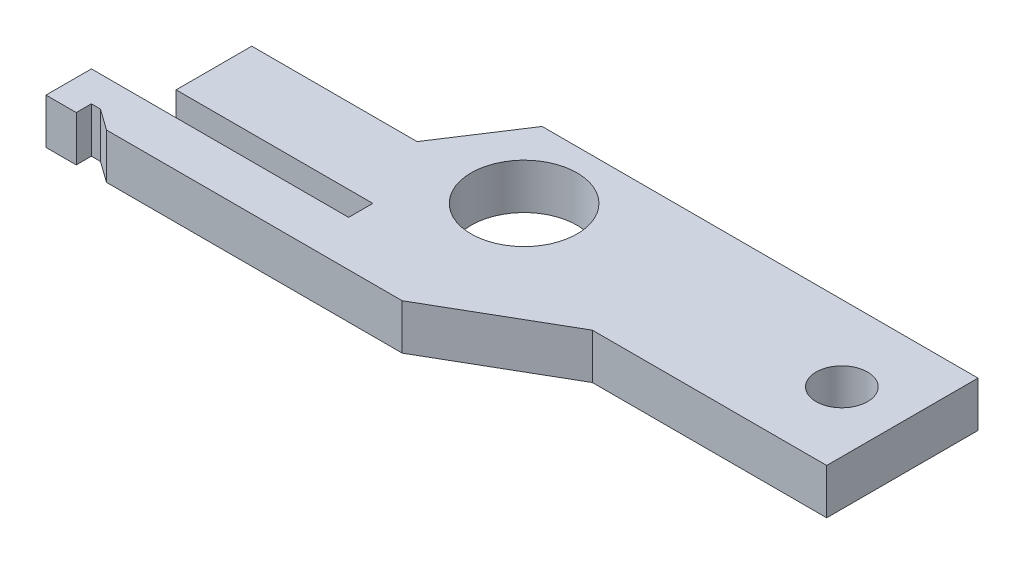
ISO-10303-21;
HEADER;
FILE_DESCRIPTION(('STEP AP214'),'2;1');
FILE_NAME('part.step','',(''),(''),'','','');
FILE_SCHEMA(('AUTOMOTIVE_DESIGN { 1 0 10303 214 1 1 1 1 }'));
ENDSEC;
DATA;
#1=APPLICATION_CONTEXT('core data for automotive mechanical design processes');
#2=APPLICATION_PROTOCOL_DEFINITION('international standard','automotive_design',2000,#1);
#3=PRODUCT_CONTEXT('',#1,'mechanical');
#4=PRODUCT('Part','Part','',(#3));
#5=PRODUCT_RELATED_PRODUCT_CATEGORY('part','',(#4));
#6=PRODUCT_DEFINITION_FORMATION('','',#4);
#7=PRODUCT_DEFINITION_CONTEXT('part definition',#1,'design');
#8=PRODUCT_DEFINITION('design','',#6,#7);
#9=PRODUCT_DEFINITION_SHAPE('','',#8);
#10=(LENGTH_UNIT() NAMED_UNIT(*) SI_UNIT(.MILLI.,.METRE.));
#11=(NAMED_UNIT(*) PLANE_ANGLE_UNIT() SI_UNIT($,.RADIAN.));
#12=(NAMED_UNIT(*) SI_UNIT($,.STERADIAN.) SOLID_ANGLE_UNIT());
#13=UNCERTAINTY_MEASURE_WITH_UNIT(LENGTH_MEASURE(1.E-05),#10,'distance_accuracy_value','');
#14=(GEOMETRIC_REPRESENTATION_CONTEXT(3) GLOBAL_UNCERTAINTY_ASSIGNED_CONTEXT((#13)) GLOBAL_UNIT_ASSIGNED_CONTEXT((#10,
#11,#12)) REPRESENTATION_CONTEXT('',''));
#15=CARTESIAN_POINT('',(0.,0.,0.));
#16=DIRECTION('',(0.,0.,1.));
#17=DIRECTION('',(1.,0.,0.));
#18=AXIS2_PLACEMENT_3D('',#15,#16,#17);
#19=CARTESIAN_POINT('',(-1.9,5.59679211209294,0.));
#20=DIRECTION('',(-1.,0.,0.));
#21=DIRECTION('',(0.,-1.,0.));
#22=AXIS2_PLACEMENT_3D('',#19,#20,#21);
#23=PLANE('',#22);
#24=DIRECTION('',(0.,0.,1.));
#25=VECTOR('',#24,1.);
#26=CARTESIAN_POINT('',(-1.9,7.09679211209294,0.));
#27=LINE('',#26,#25);
#28=CARTESIAN_POINT('',(-1.9,7.09679211209294,-0.8));
#29=VERTEX_POINT('',#28);
#30=CARTESIAN_POINT('',(-1.9,7.09679211209294,0.));
#31=VERTEX_POINT('',#30);
#32=EDGE_CURVE('E179',#29,#31,#27,.T.);
#33=ORIENTED_EDGE('',*,*,#32,.F.);
#34=DIRECTION('',(0.,1.,0.));
#35=VECTOR('',#34,1.);
#36=CARTESIAN_POINT('',(-1.9,5.59679211209294,-0.8));
#37=LINE('',#36,#35);
#38=CARTESIAN_POINT('',(-1.9,5.59679211209294,-0.8));
#39=VERTEX_POINT('',#38);
#40=EDGE_CURVE('E11',#39,#29,#37,.T.);
#41=ORIENTED_EDGE('',*,*,#40,.F.);
#42=DIRECTION('',(0.,0.,1.));
#43=VECTOR('',#42,1.);
#44=CARTESIAN_POINT('',(-1.9,5.59679211209294,0.));
#45=LINE('',#44,#43);
#46=CARTESIAN_POINT('',(-1.9,5.59679211209294,0.));
#47=VERTEX_POINT('',#46);
#48=EDGE_CURVE('E224',#39,#47,#45,.T.);
#49=ORIENTED_EDGE('',*,*,#48,.T.);
#50=DIRECTION('',(0.,1.,0.));
#51=VECTOR('',#50,1.);
#52=CARTESIAN_POINT('',(-1.9,5.59679211209294,0.));
#53=LINE('',#52,#51);
#54=EDGE_CURVE('E37',#47,#31,#53,.T.);
#55=ORIENTED_EDGE('',*,*,#54,.T.);
#56=EDGE_LOOP('',(#33,#41,#49,#55));
#57=FACE_BOUND('',#56,.T.);
#58=ADVANCED_FACE('F34',(#57),#23,.T.);
#59=CARTESIAN_POINT('',(-1.9,5.59679211209294,-0.8));
#60=DIRECTION('',(0.,0.,1.));
#61=DIRECTION('',(1.,0.,0.));
#62=AXIS2_PLACEMENT_3D('',#59,#60,#61);
#63=PLANE('',#62);
#64=DIRECTION('',(1.,0.,0.));
#65=VECTOR('',#64,1.);
#66=CARTESIAN_POINT('',(-1.9,7.09679211209294,-0.8));
#67=LINE('',#66,#65);
#68=CARTESIAN_POINT('',(-8.4,7.09679211209294,-0.799999999999999));
#69=VERTEX_POINT('',#68);
#70=EDGE_CURVE('E222',#69,#29,#67,.T.);
#71=ORIENTED_EDGE('',*,*,#70,.F.);
#72=DIRECTION('',(0.,1.,0.));
#73=VECTOR('',#72,1.);
#74=CARTESIAN_POINT('',(-8.4,5.59679211209294,-0.799999999999999));
#75=LINE('',#74,#73);
#76=CARTESIAN_POINT('',(-8.4,5.59679211209294,-0.799999999999999));
#77=VERTEX_POINT('',#76);
#78=EDGE_CURVE('E43',#77,#69,#75,.T.);
#79=ORIENTED_EDGE('',*,*,#78,.F.);
#80=DIRECTION('',(1.,0.,0.));
#81=VECTOR('',#80,1.);
#82=CARTESIAN_POINT('',(-1.9,5.59679211209294,-0.8));
#83=LINE('',#82,#81);
#84=EDGE_CURVE('E169',#77,#39,#83,.T.);
#85=ORIENTED_EDGE('',*,*,#84,.T.);
#86=ORIENTED_EDGE('',*,*,#40,.T.);
#87=EDGE_LOOP('',(#71,#79,#85,#86));
#88=FACE_BOUND('',#87,.T.);
#89=ADVANCED_FACE('F252',(#88),#63,.T.);
#90=CARTESIAN_POINT('',(-8.4,5.59679211209294,-3.3));
#91=DIRECTION('',(-1.,0.,0.));
#92=DIRECTION('',(0.,-1.,0.));
#93=AXIS2_PLACEMENT_3D('',#90,#91,#92);
#94=PLANE('',#93);
#95=DIRECTION('',(0.,0.,1.));
#96=VECTOR('',#95,1.);
#97=CARTESIAN_POINT('',(-8.4,7.09679211209294,-3.3));
#98=LINE('',#97,#96);
#99=CARTESIAN_POINT('',(-8.4,7.09679211209294,-3.3));
#100=VERTEX_POINT('',#99);
#101=EDGE_CURVE('E156',#100,#69,#98,.T.);
#102=ORIENTED_EDGE('',*,*,#101,.F.);
#103=DIRECTION('',(0.,1.,0.));
#104=VECTOR('',#103,1.);
#105=CARTESIAN_POINT('',(-8.4,5.59679211209294,-3.3));
#106=LINE('',#105,#104);
#107=CARTESIAN_POINT('',(-8.4,5.59679211209294,-3.3));
#108=VERTEX_POINT('',#107);
#109=EDGE_CURVE('E151',#108,#100,#106,.T.);
#110=ORIENTED_EDGE('',*,*,#109,.F.);
#111=DIRECTION('',(0.,0.,1.));
#112=VECTOR('',#111,1.);
#113=CARTESIAN_POINT('',(-8.4,5.59679211209294,-3.3));
#114=LINE('',#113,#112);
#115=EDGE_CURVE('E154',#108,#77,#114,.T.);
#116=ORIENTED_EDGE('',*,*,#115,.T.);
#117=ORIENTED_EDGE('',*,*,#78,.T.);
#118=EDGE_LOOP('',(#102,#110,#116,#117));
#119=FACE_BOUND('',#118,.T.);
#120=ADVANCED_FACE('F153',(#119),#94,.T.);
#121=CARTESIAN_POINT('',(-2.93675186582121,5.59679211209294,-3.3));
#122=DIRECTION('',(0.,0.,-1.));
#123=DIRECTION('',(-1.,0.,0.));
#124=AXIS2_PLACEMENT_3D('',#121,#122,#123);
#125=PLANE('',#124);
#126=DIRECTION('',(-1.,0.,0.));
#127=VECTOR('',#126,1.);
#128=CARTESIAN_POINT('',(-2.93675186582121,7.09679211209294,-3.3));
#129=LINE('',#128,#127);
#130=CARTESIAN_POINT('',(-2.93675186582121,7.09679211209294,-3.3));
#131=VERTEX_POINT('',#130);
#132=EDGE_CURVE('E219',#131,#100,#129,.T.);
#133=ORIENTED_EDGE('',*,*,#132,.F.);
#134=DIRECTION('',(0.,1.,0.));
#135=VECTOR('',#134,1.);
#136=CARTESIAN_POINT('',(-2.93675186582121,5.59679211209294,-3.3));
#137=LINE('',#136,#135);
#138=CARTESIAN_POINT('',(-2.93675186582121,5.59679211209294,-3.3));
#139=VERTEX_POINT('',#138);
#140=EDGE_CURVE('E161',#139,#131,#137,.T.);
#141=ORIENTED_EDGE('',*,*,#140,.F.);
#142=DIRECTION('',(-1.,0.,0.));
#143=VECTOR('',#142,1.);
#144=CARTESIAN_POINT('',(-2.93675186582121,5.59679211209294,-3.3));
#145=LINE('',#144,#143);
#146=EDGE_CURVE('E167',#139,#108,#145,.T.);
#147=ORIENTED_EDGE('',*,*,#146,.T.);
#148=ORIENTED_EDGE('',*,*,#109,.T.);
#149=EDGE_LOOP('',(#133,#141,#147,#148));
#150=FACE_BOUND('',#149,.T.);
#151=ADVANCED_FACE('F171',(#150),#125,.T.);
#152=CARTESIAN_POINT('',(-1.30341287344148,5.59679211209294,-5.8));
#153=DIRECTION('',(-0.837165332308695,0.,-0.546949912131332));
#154=DIRECTION('',(-0.546949912131332,0.,0.837165332308695));
#155=AXIS2_PLACEMENT_3D('',#152,#153,#154);
#156=PLANE('',#155);
#157=DIRECTION('',(-0.546949912131332,0.,0.837165332308695));
#158=VECTOR('',#157,1.);
#159=CARTESIAN_POINT('',(-1.30341287344148,7.09679211209294,-5.8));
#160=LINE('',#159,#158);
#161=CARTESIAN_POINT('',(-1.30341287344148,7.09679211209294,-5.8));
#162=VERTEX_POINT('',#161);
#163=EDGE_CURVE('E216',#162,#131,#160,.T.);
#164=ORIENTED_EDGE('',*,*,#163,.F.);
#165=DIRECTION('',(0.,1.,0.));
#166=VECTOR('',#165,1.);
#167=CARTESIAN_POINT('',(-1.30341287344148,5.59679211209294,-5.8));
#168=LINE('',#167,#166);
#169=CARTESIAN_POINT('',(-1.30341287344148,5.59679211209294,-5.8));
#170=VERTEX_POINT('',#169);
#171=EDGE_CURVE('E228',#170,#162,#168,.T.);
#172=ORIENTED_EDGE('',*,*,#171,.F.);
#173=DIRECTION('',(-0.546949912131332,0.,0.837165332308695));
#174=VECTOR('',#173,1.);
#175=CARTESIAN_POINT('',(-1.30341287344148,5.59679211209294,-5.8));
#176=LINE('',#175,#174);
#177=EDGE_CURVE('E172',#170,#139,#176,.T.);
#178=ORIENTED_EDGE('',*,*,#177,.T.);
#179=ORIENTED_EDGE('',*,*,#140,.T.);
#180=EDGE_LOOP('',(#164,#172,#178,#179));
#181=FACE_BOUND('',#180,.T.);
#182=ADVANCED_FACE('F265',(#181),#156,.T.);
#183=CARTESIAN_POINT('',(13.1,5.59679211209294,-5.8));
#184=DIRECTION('',(0.,0.,-1.));
#185=DIRECTION('',(0.,1.,0.));
#186=AXIS2_PLACEMENT_3D('',#183,#184,#185);
#187=PLANE('',#186);
#188=DIRECTION('',(-1.,0.,0.));
#189=VECTOR('',#188,1.);
#190=CARTESIAN_POINT('',(13.1,7.09679211209294,-5.8));
#191=LINE('',#190,#189);
#192=CARTESIAN_POINT('',(13.1,7.09679211209294,-5.8));
#193=VERTEX_POINT('',#192);
#194=EDGE_CURVE('E213',#193,#162,#191,.T.);
#195=ORIENTED_EDGE('',*,*,#194,.F.);
#196=DIRECTION('',(0.,1.,0.));
#197=VECTOR('',#196,1.);
#198=CARTESIAN_POINT('',(13.1,5.59679211209294,-5.8));
#199=LINE('',#198,#197);
#200=CARTESIAN_POINT('',(13.1,5.59679211209294,-5.8));
#201=VERTEX_POINT('',#200);
#202=EDGE_CURVE('E230',#201,#193,#199,.T.);
#203=ORIENTED_EDGE('',*,*,#202,.F.);
#204=DIRECTION('',(-1.,0.,0.));
#205=VECTOR('',#204,1.);
#206=CARTESIAN_POINT('',(13.1,5.59679211209294,-5.8));
#207=LINE('',#206,#205);
#208=EDGE_CURVE('E174',#201,#170,#207,.T.);
#209=ORIENTED_EDGE('',*,*,#208,.T.);
#210=ORIENTED_EDGE('',*,*,#171,.T.);
#211=EDGE_LOOP('',(#195,#203,#209,#210));
#212=FACE_BOUND('',#211,.T.);
#213=ADVANCED_FACE('F268',(#212),#187,.T.);
#214=CARTESIAN_POINT('',(13.1,5.59679211209294,-0.800000000000001));
#215=DIRECTION('',(1.,0.,0.));
#216=DIRECTION('',(0.,1.,0.));
#217=AXIS2_PLACEMENT_3D('',#214,#215,#216);
#218=PLANE('',#217);
#219=DIRECTION('',(0.,0.,-1.));
#220=VECTOR('',#219,1.);
#221=CARTESIAN_POINT('',(13.1,7.09679211209294,-0.800000000000001));
#222=LINE('',#221,#220);
#223=CARTESIAN_POINT('',(13.1,7.09679211209294,-0.800000000000001));
#224=VERTEX_POINT('',#223);
#225=EDGE_CURVE('E210',#224,#193,#222,.T.);
#226=ORIENTED_EDGE('',*,*,#225,.F.);
#227=DIRECTION('',(0.,1.,0.));
#228=VECTOR('',#227,1.);
#229=CARTESIAN_POINT('',(13.1,5.59679211209294,-0.800000000000001));
#230=LINE('',#229,#228);
#231=CARTESIAN_POINT('',(13.1,5.59679211209294,-0.800000000000001));
#232=VERTEX_POINT('',#231);
#233=EDGE_CURVE('E232',#232,#224,#230,.T.);
#234=ORIENTED_EDGE('',*,*,#233,.F.);
#235=DIRECTION('',(0.,0.,-1.));
#236=VECTOR('',#235,1.);
#237=CARTESIAN_POINT('',(13.1,5.59679211209294,-0.800000000000001));
#238=LINE('',#237,#236);
#239=EDGE_CURVE('E370',#232,#201,#238,.T.);
#240=ORIENTED_EDGE('',*,*,#239,.T.);
#241=ORIENTED_EDGE('',*,*,#202,.T.);
#242=EDGE_LOOP('',(#226,#234,#240,#241));
#243=FACE_BOUND('',#242,.T.);
#244=ADVANCED_FACE('F272',(#243),#218,.T.);
#245=CARTESIAN_POINT('',(5.35550541840249,5.59679211209294,-0.800000000000001));
#246=DIRECTION('',(0.,0.,1.));
#247=DIRECTION('',(1.,0.,0.));
#248=AXIS2_PLACEMENT_3D('',#245,#246,#247);
#249=PLANE('',#248);
#250=DIRECTION('',(1.,0.,0.));
#251=VECTOR('',#250,1.);
#252=CARTESIAN_POINT('',(5.35550541840249,7.09679211209294,-0.800000000000001));
#253=LINE('',#252,#251);
#254=CARTESIAN_POINT('',(5.35550541840249,7.09679211209294,-0.800000000000001));
#255=VERTEX_POINT('',#254);
#256=EDGE_CURVE('E207',#255,#224,#253,.T.);
#257=ORIENTED_EDGE('',*,*,#256,.F.);
#258=DIRECTION('',(0.,1.,0.));
#259=VECTOR('',#258,1.);
#260=CARTESIAN_POINT('',(5.35550541840249,5.59679211209294,-0.800000000000001));
#261=LINE('',#260,#259);
#262=CARTESIAN_POINT('',(5.35550541840249,5.59679211209294,-0.800000000000001));
#263=VERTEX_POINT('',#262);
#264=EDGE_CURVE('E234',#263,#255,#261,.T.);
#265=ORIENTED_EDGE('',*,*,#264,.F.);
#266=DIRECTION('',(1.,0.,0.));
#267=VECTOR('',#266,1.);
#268=CARTESIAN_POINT('',(5.35550541840249,5.59679211209294,-0.800000000000001));
#269=LINE('',#268,#267);
#270=EDGE_CURVE('E367',#263,#232,#269,.T.);
#271=ORIENTED_EDGE('',*,*,#270,.T.);
#272=ORIENTED_EDGE('',*,*,#233,.T.);
#273=EDGE_LOOP('',(#257,#265,#271,#272));
#274=FACE_BOUND('',#273,.T.);
#275=ADVANCED_FACE('F276',(#274),#249,.T.);
#276=CARTESIAN_POINT('',(1.37178856099409,5.59679211209294,1.5));
#277=DIRECTION('',(0.500000000000001,0.,0.866025403784438));
#278=DIRECTION('',(0.866025403784438,0.,-0.500000000000001));
#279=AXIS2_PLACEMENT_3D('',#276,#277,#278);
#280=PLANE('',#279);
#281=DIRECTION('',(0.866025403784438,0.,-0.500000000000001));
#282=VECTOR('',#281,1.);
#283=CARTESIAN_POINT('',(1.37178856099409,7.09679211209294,1.5));
#284=LINE('',#283,#282);
#285=CARTESIAN_POINT('',(1.37178856099409,7.09679211209294,1.5));
#286=VERTEX_POINT('',#285);
#287=EDGE_CURVE('E204',#286,#255,#284,.T.);
#288=ORIENTED_EDGE('',*,*,#287,.F.);
#289=DIRECTION('',(0.,1.,0.));
#290=VECTOR('',#289,1.);
#291=CARTESIAN_POINT('',(1.37178856099409,5.59679211209294,1.5));
#292=LINE('',#291,#290);
#293=CARTESIAN_POINT('',(1.37178856099409,5.59679211209294,1.5));
#294=VERTEX_POINT('',#293);
#295=EDGE_CURVE('E236',#294,#286,#292,.T.);
#296=ORIENTED_EDGE('',*,*,#295,.F.);
#297=DIRECTION('',(0.866025403784438,0.,-0.500000000000001));
#298=VECTOR('',#297,1.);
#299=CARTESIAN_POINT('',(1.37178856099409,5.59679211209294,1.5));
#300=LINE('',#299,#298);
#301=EDGE_CURVE('E364',#294,#263,#300,.T.);
#302=ORIENTED_EDGE('',*,*,#301,.T.);
#303=ORIENTED_EDGE('',*,*,#264,.T.);
#304=EDGE_LOOP('',(#288,#296,#302,#303));
#305=FACE_BOUND('',#304,.T.);
#306=ADVANCED_FACE('F280',(#305),#280,.T.);
#307=CARTESIAN_POINT('',(-8.4,5.59679211209294,1.5));
#308=DIRECTION('',(0.,0.,1.));
#309=DIRECTION('',(0.,-1.,0.));
#310=AXIS2_PLACEMENT_3D('',#307,#308,#309);
#311=PLANE('',#310);
#312=DIRECTION('',(1.,0.,0.));
#313=VECTOR('',#312,1.);
#314=CARTESIAN_POINT('',(-8.4,7.09679211209294,1.5));
#315=LINE('',#314,#313);
#316=CARTESIAN_POINT('',(-8.4,7.09679211209294,1.5));
#317=VERTEX_POINT('',#316);
#318=EDGE_CURVE('E201',#317,#286,#315,.T.);
#319=ORIENTED_EDGE('',*,*,#318,.F.);
#320=DIRECTION('',(0.,1.,0.));
#321=VECTOR('',#320,1.);
#322=CARTESIAN_POINT('',(-8.4,5.59679211209294,1.5));
#323=LINE('',#322,#321);
#324=CARTESIAN_POINT('',(-8.4,5.59679211209294,1.5));
#325=VERTEX_POINT('',#324);
#326=EDGE_CURVE('E238',#325,#317,#323,.T.);
#327=ORIENTED_EDGE('',*,*,#326,.F.);
#328=DIRECTION('',(1.,0.,0.));
#329=VECTOR('',#328,1.);
#330=CARTESIAN_POINT('',(-8.4,5.59679211209294,1.5));
#331=LINE('',#330,#329);
#332=EDGE_CURVE('E361',#325,#294,#331,.T.);
#333=ORIENTED_EDGE('',*,*,#332,.T.);
#334=ORIENTED_EDGE('',*,*,#295,.T.);
#335=EDGE_LOOP('',(#319,#327,#333,#334));
#336=FACE_BOUND('',#335,.T.);
#337=ADVANCED_FACE('F284',(#336),#311,.T.);
#338=CARTESIAN_POINT('',(-9.1,5.59679211209294,1.));
#339=DIRECTION('',(-0.581238193719096,0.,0.813733471206735));
#340=DIRECTION('',(0.813733471206735,0.,0.581238193719096));
#341=AXIS2_PLACEMENT_3D('',#338,#339,#340);
#342=PLANE('',#341);
#343=DIRECTION('',(0.813733471206735,0.,0.581238193719096));
#344=VECTOR('',#343,1.);
#345=CARTESIAN_POINT('',(-9.1,7.09679211209294,1.));
#346=LINE('',#345,#344);
#347=CARTESIAN_POINT('',(-9.1,7.09679211209294,1.));
#348=VERTEX_POINT('',#347);
#349=EDGE_CURVE('E198',#348,#317,#346,.T.);
#350=ORIENTED_EDGE('',*,*,#349,.F.);
#351=DIRECTION('',(0.,1.,0.));
#352=VECTOR('',#351,1.);
#353=CARTESIAN_POINT('',(-9.1,5.59679211209294,1.));
#354=LINE('',#353,#352);
#355=CARTESIAN_POINT('',(-9.1,5.59679211209294,1.));
#356=VERTEX_POINT('',#355);
#357=EDGE_CURVE('E240',#356,#348,#354,.T.);
#358=ORIENTED_EDGE('',*,*,#357,.F.);
#359=DIRECTION('',(0.813733471206735,0.,0.581238193719096));
#360=VECTOR('',#359,1.);
#361=CARTESIAN_POINT('',(-9.1,5.59679211209294,1.));
#362=LINE('',#361,#360);
#363=EDGE_CURVE('E358',#356,#325,#362,.T.);
#364=ORIENTED_EDGE('',*,*,#363,.T.);
#365=ORIENTED_EDGE('',*,*,#326,.T.);
#366=EDGE_LOOP('',(#350,#358,#364,#365));
#367=FACE_BOUND('',#366,.T.);
#368=ADVANCED_FACE('F288',(#367),#342,.T.);
#369=CARTESIAN_POINT('',(-9.4,5.59679211209294,1.));
#370=DIRECTION('',(0.,0.,1.));
#371=DIRECTION('',(1.,0.,0.));
#372=AXIS2_PLACEMENT_3D('',#369,#370,#371);
#373=PLANE('',#372);
#374=DIRECTION('',(1.,0.,0.));
#375=VECTOR('',#374,1.);
#376=CARTESIAN_POINT('',(-9.4,7.09679211209294,1.));
#377=LINE('',#376,#375);
#378=CARTESIAN_POINT('',(-9.4,7.09679211209294,1.));
#379=VERTEX_POINT('',#378);
#380=EDGE_CURVE('E195',#379,#348,#377,.T.);
#381=ORIENTED_EDGE('',*,*,#380,.F.);
#382=DIRECTION('',(0.,1.,0.));
#383=VECTOR('',#382,1.);
#384=CARTESIAN_POINT('',(-9.4,5.59679211209294,1.));
#385=LINE('',#384,#383);
#386=CARTESIAN_POINT('',(-9.4,5.59679211209294,1.));
#387=VERTEX_POINT('',#386);
#388=EDGE_CURVE('E242',#387,#379,#385,.T.);
#389=ORIENTED_EDGE('',*,*,#388,.F.);
#390=DIRECTION('',(1.,0.,0.));
#391=VECTOR('',#390,1.);
#392=CARTESIAN_POINT('',(-9.4,5.59679211209294,1.));
#393=LINE('',#392,#391);
#394=EDGE_CURVE('E355',#387,#356,#393,.T.);
#395=ORIENTED_EDGE('',*,*,#394,.T.);
#396=ORIENTED_EDGE('',*,*,#357,.T.);
#397=EDGE_LOOP('',(#381,#389,#395,#396));
#398=FACE_BOUND('',#397,.T.);
#399=ADVANCED_FACE('F292',(#398),#373,.T.);
#400=CARTESIAN_POINT('',(-9.4,5.59679211209294,1.5));
#401=DIRECTION('',(1.,0.,0.));
#402=DIRECTION('',(0.,1.,0.));
#403=AXIS2_PLACEMENT_3D('',#400,#401,#402);
#404=PLANE('',#403);
#405=DIRECTION('',(0.,0.,-1.));
#406=VECTOR('',#405,1.);
#407=CARTESIAN_POINT('',(-9.4,7.09679211209294,1.5));
#408=LINE('',#407,#406);
#409=CARTESIAN_POINT('',(-9.4,7.09679211209294,1.5));
#410=VERTEX_POINT('',#409);
#411=EDGE_CURVE('E192',#410,#379,#408,.T.);
#412=ORIENTED_EDGE('',*,*,#411,.F.);
#413=DIRECTION('',(0.,1.,0.));
#414=VECTOR('',#413,1.);
#415=CARTESIAN_POINT('',(-9.4,5.59679211209294,1.5));
#416=LINE('',#415,#414);
#417=CARTESIAN_POINT('',(-9.4,5.59679211209294,1.5));
#418=VERTEX_POINT('',#417);
#419=EDGE_CURVE('E244',#418,#410,#416,.T.);
#420=ORIENTED_EDGE('',*,*,#419,.F.);
#421=DIRECTION('',(0.,0.,-1.));
#422=VECTOR('',#421,1.);
#423=CARTESIAN_POINT('',(-9.4,5.59679211209294,1.5));
#424=LINE('',#423,#422);
#425=EDGE_CURVE('E352',#418,#387,#424,.T.);
#426=ORIENTED_EDGE('',*,*,#425,.T.);
#427=ORIENTED_EDGE('',*,*,#388,.T.);
#428=EDGE_LOOP('',(#412,#420,#426,#427));
#429=FACE_BOUND('',#428,.T.);
#430=ADVANCED_FACE('F296',(#429),#404,.T.);
#431=CARTESIAN_POINT('',(-10.4,5.59679211209294,1.5));
#432=DIRECTION('',(0.,0.,1.));
#433=DIRECTION('',(1.,0.,0.));
#434=AXIS2_PLACEMENT_3D('',#431,#432,#433);
#435=PLANE('',#434);
#436=DIRECTION('',(1.,0.,0.));
#437=VECTOR('',#436,1.);
#438=CARTESIAN_POINT('',(-10.4,7.09679211209294,1.5));
#439=LINE('',#438,#437);
#440=CARTESIAN_POINT('',(-10.4,7.09679211209294,1.5));
#441=VERTEX_POINT('',#440);
#442=EDGE_CURVE('E189',#441,#410,#439,.T.);
#443=ORIENTED_EDGE('',*,*,#442,.F.);
#444=DIRECTION('',(0.,1.,0.));
#445=VECTOR('',#444,1.);
#446=CARTESIAN_POINT('',(-10.4,5.59679211209294,1.5));
#447=LINE('',#446,#445);
#448=CARTESIAN_POINT('',(-10.4,5.59679211209294,1.5));
#449=VERTEX_POINT('',#448);
#450=EDGE_CURVE('E246',#449,#441,#447,.T.);
#451=ORIENTED_EDGE('',*,*,#450,.F.);
#452=DIRECTION('',(1.,0.,0.));
#453=VECTOR('',#452,1.);
#454=CARTESIAN_POINT('',(-10.4,5.59679211209294,1.5));
#455=LINE('',#454,#453);
#456=EDGE_CURVE('E349',#449,#418,#455,.T.);
#457=ORIENTED_EDGE('',*,*,#456,.T.);
#458=ORIENTED_EDGE('',*,*,#419,.T.);
#459=EDGE_LOOP('',(#443,#451,#457,#458));
#460=FACE_BOUND('',#459,.T.);
#461=ADVANCED_FACE('F300',(#460),#435,.T.);
#462=CARTESIAN_POINT('',(-10.4,5.59679211209294,0.));
#463=DIRECTION('',(-1.,0.,0.));
#464=DIRECTION('',(0.,-1.,0.));
#465=AXIS2_PLACEMENT_3D('',#462,#463,#464);
#466=PLANE('',#465);
#467=DIRECTION('',(0.,0.,1.));
#468=VECTOR('',#467,1.);
#469=CARTESIAN_POINT('',(-10.4,7.09679211209294,0.));
#470=LINE('',#469,#468);
#471=CARTESIAN_POINT('',(-10.4,7.09679211209294,0.));
#472=VERTEX_POINT('',#471);
#473=EDGE_CURVE('E186',#472,#441,#470,.T.);
#474=ORIENTED_EDGE('',*,*,#473,.F.);
#475=DIRECTION('',(0.,1.,0.));
#476=VECTOR('',#475,1.);
#477=CARTESIAN_POINT('',(-10.4,5.59679211209294,0.));
#478=LINE('',#477,#476);
#479=CARTESIAN_POINT('',(-10.4,5.59679211209294,0.));
#480=VERTEX_POINT('',#479);
#481=EDGE_CURVE('E247',#480,#472,#478,.T.);
#482=ORIENTED_EDGE('',*,*,#481,.F.);
#483=DIRECTION('',(0.,0.,1.));
#484=VECTOR('',#483,1.);
#485=CARTESIAN_POINT('',(-10.4,5.59679211209294,0.));
#486=LINE('',#485,#484);
#487=EDGE_CURVE('E346',#480,#449,#486,.T.);
#488=ORIENTED_EDGE('',*,*,#487,.T.);
#489=ORIENTED_EDGE('',*,*,#450,.T.);
#490=EDGE_LOOP('',(#474,#482,#488,#489));
#491=FACE_BOUND('',#490,.T.);
#492=ADVANCED_FACE('F304',(#491),#466,.T.);
#493=CARTESIAN_POINT('',(-1.9,5.59679211209294,0.));
#494=DIRECTION('',(0.,0.,-1.));
#495=DIRECTION('',(-1.,0.,0.));
#496=AXIS2_PLACEMENT_3D('',#493,#494,#495);
#497=PLANE('',#496);
#498=DIRECTION('',(-1.,0.,0.));
#499=VECTOR('',#498,1.);
#500=CARTESIAN_POINT('',(-1.9,7.09679211209294,0.));
#501=LINE('',#500,#499);
#502=EDGE_CURVE('E182',#31,#472,#501,.T.);
#503=ORIENTED_EDGE('',*,*,#502,.F.);
#504=ORIENTED_EDGE('',*,*,#54,.F.);
#505=DIRECTION('',(-1.,0.,0.));
#506=VECTOR('',#505,1.);
#507=CARTESIAN_POINT('',(-1.9,5.59679211209294,0.));
#508=LINE('',#507,#506);
#509=EDGE_CURVE('E344',#47,#480,#508,.T.);
#510=ORIENTED_EDGE('',*,*,#509,.T.);
#511=ORIENTED_EDGE('',*,*,#481,.T.);
#512=EDGE_LOOP('',(#503,#504,#510,#511));
#513=FACE_BOUND('',#512,.T.);
#514=ADVANCED_FACE('F249',(#513),#497,.T.);
#515=CARTESIAN_POINT('',(0.,5.59679211209294,0.));
#516=DIRECTION('',(0.,1.,0.));
#517=DIRECTION('',(-1.,0.,0.));
#518=AXIS2_PLACEMENT_3D('',#515,#516,#517);
#519=PLANE('',#518);
#520=CARTESIAN_POINT('',(0.6,5.59679211209294,-3.3));
#521=DIRECTION('',(0.,1.,0.));
#522=DIRECTION('',(-1.,0.,0.));
#523=AXIS2_PLACEMENT_3D('',#520,#521,#522);
#524=CIRCLE('',#523,1.75);
#525=CARTESIAN_POINT('',(-1.15,5.59679211209294,-3.3));
#526=VERTEX_POINT('',#525);
#527=EDGE_CURVE('E331',#526,#526,#524,.T.);
#528=ORIENTED_EDGE('',*,*,#527,.T.);
#529=EDGE_LOOP('',(#528));
#530=FACE_BOUND('',#529,.T.);
#531=CARTESIAN_POINT('',(11.1,5.59679211209294,-3.3));
#532=DIRECTION('',(0.,1.,0.));
#533=DIRECTION('',(-1.,0.,0.));
#534=AXIS2_PLACEMENT_3D('',#531,#532,#533);
#535=CIRCLE('',#534,0.85);
#536=CARTESIAN_POINT('',(10.25,5.59679211209294,-3.3));
#537=VERTEX_POINT('',#536);
#538=EDGE_CURVE('E183',#537,#537,#535,.T.);
#539=ORIENTED_EDGE('',*,*,#538,.T.);
#540=EDGE_LOOP('',(#539));
#541=FACE_BOUND('',#540,.T.);
#542=ORIENTED_EDGE('',*,*,#48,.F.);
#543=ORIENTED_EDGE('',*,*,#84,.F.);
#544=ORIENTED_EDGE('',*,*,#115,.F.);
#545=ORIENTED_EDGE('',*,*,#146,.F.);
#546=ORIENTED_EDGE('',*,*,#177,.F.);
#547=ORIENTED_EDGE('',*,*,#208,.F.);
#548=ORIENTED_EDGE('',*,*,#239,.F.);
#549=ORIENTED_EDGE('',*,*,#270,.F.);
#550=ORIENTED_EDGE('',*,*,#301,.F.);
#551=ORIENTED_EDGE('',*,*,#332,.F.);
#552=ORIENTED_EDGE('',*,*,#363,.F.);
#553=ORIENTED_EDGE('',*,*,#394,.F.);
#554=ORIENTED_EDGE('',*,*,#425,.F.);
#555=ORIENTED_EDGE('',*,*,#456,.F.);
#556=ORIENTED_EDGE('',*,*,#487,.F.);
#557=ORIENTED_EDGE('',*,*,#509,.F.);
#558=EDGE_LOOP('',(#542,#543,#544,#545,#546,#547,#548,#549,#550,#551,#552,#553,#554,#555,#556,#557));
#559=FACE_BOUND('',#558,.T.);
#560=ADVANCED_FACE('F165',(#530,#541,#559),#519,.F.);
#561=CARTESIAN_POINT('',(0.,7.09679211209294,0.));
#562=DIRECTION('',(0.,1.,0.));
#563=DIRECTION('',(-1.,0.,0.));
#564=AXIS2_PLACEMENT_3D('',#561,#562,#563);
#565=PLANE('',#564);
#566=CARTESIAN_POINT('',(0.599999999999999,7.09679211209294,-3.3));
#567=DIRECTION('',(0.,1.,0.));
#568=DIRECTION('',(-1.,0.,0.));
#569=AXIS2_PLACEMENT_3D('',#566,#567,#568);
#570=CIRCLE('',#569,1.75);
#571=CARTESIAN_POINT('',(-1.15,7.09679211209294,-3.3));
#572=VERTEX_POINT('',#571);
#573=EDGE_CURVE('E334',#572,#572,#570,.T.);
#574=ORIENTED_EDGE('',*,*,#573,.F.);
#575=EDGE_LOOP('',(#574));
#576=FACE_BOUND('',#575,.T.);
#577=CARTESIAN_POINT('',(11.1,7.09679211209294,-3.3));
#578=DIRECTION('',(0.,1.,0.));
#579=DIRECTION('',(-1.,0.,0.));
#580=AXIS2_PLACEMENT_3D('',#577,#578,#579);
#581=CIRCLE('',#580,0.85);
#582=CARTESIAN_POINT('',(10.25,7.09679211209294,-3.3));
#583=VERTEX_POINT('',#582);
#584=EDGE_CURVE('E336',#583,#583,#581,.T.);
#585=ORIENTED_EDGE('',*,*,#584,.F.);
#586=EDGE_LOOP('',(#585));
#587=FACE_BOUND('',#586,.T.);
#588=ORIENTED_EDGE('',*,*,#32,.T.);
#589=ORIENTED_EDGE('',*,*,#502,.T.);
#590=ORIENTED_EDGE('',*,*,#473,.T.);
#591=ORIENTED_EDGE('',*,*,#442,.T.);
#592=ORIENTED_EDGE('',*,*,#411,.T.);
#593=ORIENTED_EDGE('',*,*,#380,.T.);
#594=ORIENTED_EDGE('',*,*,#349,.T.);
#595=ORIENTED_EDGE('',*,*,#318,.T.);
#596=ORIENTED_EDGE('',*,*,#287,.T.);
#597=ORIENTED_EDGE('',*,*,#256,.T.);
#598=ORIENTED_EDGE('',*,*,#225,.T.);
#599=ORIENTED_EDGE('',*,*,#194,.T.);
#600=ORIENTED_EDGE('',*,*,#163,.T.);
#601=ORIENTED_EDGE('',*,*,#132,.T.);
#602=ORIENTED_EDGE('',*,*,#101,.T.);
#603=ORIENTED_EDGE('',*,*,#70,.T.);
#604=EDGE_LOOP('',(#588,#589,#590,#591,#592,#593,#594,#595,#596,#597,#598,#599,#600,#601,#602,#603));
#605=FACE_BOUND('',#604,.T.);
#606=ADVANCED_FACE('F251',(#576,#587,#605),#565,.T.);
#607=CARTESIAN_POINT('',(11.1,5.59679211209294,-3.3));
#608=DIRECTION('',(0.,1.,0.));
#609=DIRECTION('',(-1.,0.,0.));
#610=AXIS2_PLACEMENT_3D('',#607,#608,#609);
#611=CYLINDRICAL_SURFACE('',#610,0.85);
#612=ORIENTED_EDGE('',*,*,#538,.F.);
#613=EDGE_LOOP('',(#612));
#614=FACE_BOUND('',#613,.T.);
#615=ORIENTED_EDGE('',*,*,#584,.T.);
#616=EDGE_LOOP('',(#615));
#617=FACE_BOUND('',#616,.T.);
#618=ADVANCED_FACE('F316',(#614,#617),#611,.F.);
#619=CARTESIAN_POINT('',(0.6,5.59679211209294,-3.3));
#620=DIRECTION('',(0.,1.,0.));
#621=DIRECTION('',(-1.,0.,0.));
#622=AXIS2_PLACEMENT_3D('',#619,#620,#621);
#623=CYLINDRICAL_SURFACE('',#622,1.75);
#624=ORIENTED_EDGE('',*,*,#527,.F.);
#625=EDGE_LOOP('',(#624));
#626=FACE_BOUND('',#625,.T.);
#627=ORIENTED_EDGE('',*,*,#573,.T.);
#628=EDGE_LOOP('',(#627));
#629=FACE_BOUND('',#628,.T.);
#630=ADVANCED_FACE('F323',(#626,#629),#623,.F.);
#631=CLOSED_SHELL('',(#58,#89,#120,#151,#182,#213,#244,#275,#306,#337,#368,#399,#430,#461,#492,
#514,#560,#606,#618,#630));
#632=MANIFOLD_SOLID_BREP('B2',#631);
#633=ADVANCED_BREP_SHAPE_REPRESENTATION('',(#18,#632),#14);
#634=SHAPE_DEFINITION_REPRESENTATION(#9,#633);
ENDSEC;
END-ISO-10303-21;
